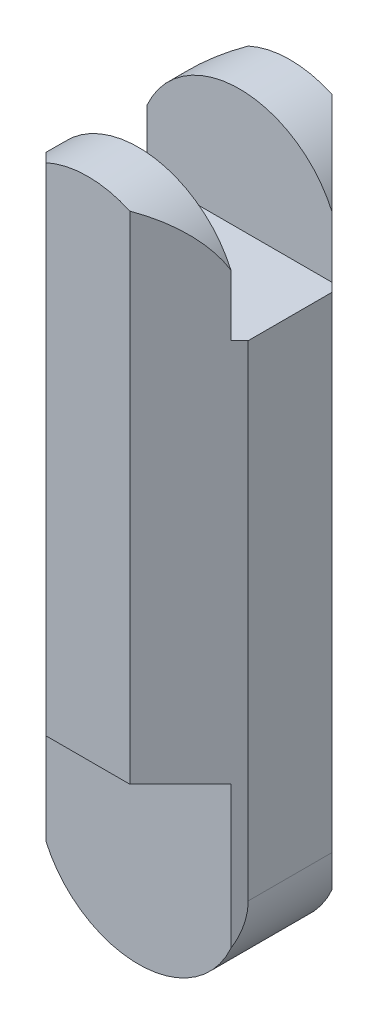
ISO-10303-21;
HEADER;
FILE_DESCRIPTION(('STEP AP214'),'2;1');
FILE_NAME('part.step','',(''),(''),'','','');
FILE_SCHEMA(('AUTOMOTIVE_DESIGN { 1 0 10303 214 1 1 1 1 }'));
ENDSEC;
DATA;
#1=APPLICATION_CONTEXT('core data for automotive mechanical design processes');
#2=APPLICATION_PROTOCOL_DEFINITION('international standard','automotive_design',2000,#1);
#3=PRODUCT_CONTEXT('',#1,'mechanical');
#4=PRODUCT('Part','Part','',(#3));
#5=PRODUCT_RELATED_PRODUCT_CATEGORY('part','',(#4));
#6=PRODUCT_DEFINITION_FORMATION('','',#4);
#7=PRODUCT_DEFINITION_CONTEXT('part definition',#1,'design');
#8=PRODUCT_DEFINITION('design','',#6,#7);
#9=PRODUCT_DEFINITION_SHAPE('','',#8);
#10=(LENGTH_UNIT() NAMED_UNIT(*) SI_UNIT(.MILLI.,.METRE.));
#11=(NAMED_UNIT(*) PLANE_ANGLE_UNIT() SI_UNIT($,.RADIAN.));
#12=(NAMED_UNIT(*) SI_UNIT($,.STERADIAN.) SOLID_ANGLE_UNIT());
#13=UNCERTAINTY_MEASURE_WITH_UNIT(LENGTH_MEASURE(1.E-05),#10,'distance_accuracy_value','');
#14=(GEOMETRIC_REPRESENTATION_CONTEXT(3) GLOBAL_UNCERTAINTY_ASSIGNED_CONTEXT((#13)) GLOBAL_UNIT_ASSIGNED_CONTEXT((#10,
#11,#12)) REPRESENTATION_CONTEXT('',''));
#15=CARTESIAN_POINT('',(0.,0.,0.));
#16=DIRECTION('',(0.,0.,1.));
#17=DIRECTION('',(1.,0.,0.));
#18=AXIS2_PLACEMENT_3D('',#15,#16,#17);
#19=CARTESIAN_POINT('',(4.14213562373094,78.,-10.));
#20=DIRECTION('',(0.,0.,1.));
#21=DIRECTION('',(1.,0.,0.));
#22=AXIS2_PLACEMENT_3D('',#19,#20,#21);
#23=PLANE('',#22);
#24=DIRECTION('',(0.,-1.,0.));
#25=VECTOR('',#24,1.);
#26=CARTESIAN_POINT('',(-4.14213562373096,78.,-10.));
#27=LINE('',#26,#25);
#28=CARTESIAN_POINT('',(-4.14213562373096,69.1017972112445,-10.));
#29=VERTEX_POINT('',#28);
#30=CARTESIAN_POINT('',(-4.14213562373096,20.,-10.));
#31=VERTEX_POINT('',#30);
#32=EDGE_CURVE('E174',#29,#31,#27,.T.);
#33=ORIENTED_EDGE('',*,*,#32,.F.);
#34=CARTESIAN_POINT('',(0.,60.,-10.));
#35=DIRECTION('',(0.,0.,1.));
#36=DIRECTION('',(1.,0.,0.));
#37=AXIS2_PLACEMENT_3D('',#34,#35,#36);
#38=CIRCLE('',#37,10.);
#39=CARTESIAN_POINT('',(4.14213562373094,69.1017972112445,-10.));
#40=VERTEX_POINT('',#39);
#41=EDGE_CURVE('E297',#29,#40,#38,.F.);
#42=ORIENTED_EDGE('',*,*,#41,.T.);
#43=DIRECTION('',(0.,-1.,0.));
#44=VECTOR('',#43,1.);
#45=CARTESIAN_POINT('',(4.14213562373094,78.,-10.));
#46=LINE('',#45,#44);
#47=CARTESIAN_POINT('',(4.14213562373094,20.,-10.));
#48=VERTEX_POINT('',#47);
#49=EDGE_CURVE('E176',#40,#48,#46,.T.);
#50=ORIENTED_EDGE('',*,*,#49,.T.);
#51=DIRECTION('',(1.,0.,0.));
#52=VECTOR('',#51,1.);
#53=CARTESIAN_POINT('',(10.,20.,-10.));
#54=LINE('',#53,#52);
#55=EDGE_CURVE('E232',#31,#48,#54,.T.);
#56=ORIENTED_EDGE('',*,*,#55,.F.);
#57=EDGE_LOOP('',(#33,#42,#50,#56));
#58=FACE_BOUND('',#57,.T.);
#59=ADVANCED_FACE('F34',(#58),#23,.F.);
#60=CARTESIAN_POINT('',(-4.14213562373096,78.,10.));
#61=DIRECTION('',(0.,0.,-1.));
#62=DIRECTION('',(-1.,0.,0.));
#63=AXIS2_PLACEMENT_3D('',#60,#61,#62);
#64=PLANE('',#63);
#65=DIRECTION('',(0.,-1.,0.));
#66=VECTOR('',#65,1.);
#67=CARTESIAN_POINT('',(4.14213562373096,78.,10.));
#68=LINE('',#67,#66);
#69=CARTESIAN_POINT('',(4.14213562373096,69.1017972112445,10.));
#70=VERTEX_POINT('',#69);
#71=CARTESIAN_POINT('',(4.14213562373096,20.,10.));
#72=VERTEX_POINT('',#71);
#73=EDGE_CURVE('E159',#70,#72,#68,.T.);
#74=ORIENTED_EDGE('',*,*,#73,.F.);
#75=CARTESIAN_POINT('',(0.,60.,10.));
#76=DIRECTION('',(0.,0.,-1.));
#77=DIRECTION('',(1.,0.,0.));
#78=AXIS2_PLACEMENT_3D('',#75,#76,#77);
#79=CIRCLE('',#78,10.);
#80=CARTESIAN_POINT('',(-4.14213562373096,69.1017972112445,10.));
#81=VERTEX_POINT('',#80);
#82=EDGE_CURVE('E147',#81,#70,#79,.T.);
#83=ORIENTED_EDGE('',*,*,#82,.F.);
#84=DIRECTION('',(0.,-1.,0.));
#85=VECTOR('',#84,1.);
#86=CARTESIAN_POINT('',(-4.14213562373096,78.,10.));
#87=LINE('',#86,#85);
#88=CARTESIAN_POINT('',(-4.14213562373096,20.,10.));
#89=VERTEX_POINT('',#88);
#90=EDGE_CURVE('E157',#81,#89,#87,.T.);
#91=ORIENTED_EDGE('',*,*,#90,.T.);
#92=DIRECTION('',(-1.,0.,0.));
#93=VECTOR('',#92,1.);
#94=CARTESIAN_POINT('',(-10.,20.,10.));
#95=LINE('',#94,#93);
#96=EDGE_CURVE('E245',#72,#89,#95,.T.);
#97=ORIENTED_EDGE('',*,*,#96,.F.);
#98=EDGE_LOOP('',(#74,#83,#91,#97));
#99=FACE_BOUND('',#98,.T.);
#100=ADVANCED_FACE('F155',(#99),#64,.F.);
#101=CARTESIAN_POINT('',(10.,78.,-4.14213562373095));
#102=DIRECTION('',(-0.707106781186547,0.,0.707106781186548));
#103=DIRECTION('',(0.707106781186548,0.,0.707106781186547));
#104=AXIS2_PLACEMENT_3D('',#101,#102,#103);
#105=PLANE('',#104);
#106=ORIENTED_EDGE('',*,*,#49,.F.);
#107=CARTESIAN_POINT('',(0.,60.,-14.1421356237309));
#108=DIRECTION('',(-0.707106781186547,0.,0.707106781186548));
#109=DIRECTION('',(0.707106781186548,0.,0.707106781186547));
#110=AXIS2_PLACEMENT_3D('',#107,#108,#109);
#111=ELLIPSE('',#110,14.1421356237309,10.);
#112=CARTESIAN_POINT('',(9.14213562373095,64.0523272618718,-5.));
#113=VERTEX_POINT('',#112);
#114=EDGE_CURVE('E300',#40,#113,#111,.F.);
#115=ORIENTED_EDGE('',*,*,#114,.T.);
#116=DIRECTION('',(0.,1.,0.));
#117=VECTOR('',#116,1.);
#118=CARTESIAN_POINT('',(9.14213562373095,78.,-5.));
#119=LINE('',#118,#117);
#120=CARTESIAN_POINT('',(9.14213562373095,58.,-5.));
#121=VERTEX_POINT('',#120);
#122=EDGE_CURVE('E221',#121,#113,#119,.T.);
#123=ORIENTED_EDGE('',*,*,#122,.F.);
#124=DIRECTION('',(0.707106781186548,0.,0.707106781186547));
#125=VECTOR('',#124,1.);
#126=CARTESIAN_POINT('',(10.,58.,-4.14213562373095));
#127=LINE('',#126,#125);
#128=CARTESIAN_POINT('',(10.,58.,-4.14213562373095));
#129=VERTEX_POINT('',#128);
#130=EDGE_CURVE('E230',#121,#129,#127,.T.);
#131=ORIENTED_EDGE('',*,*,#130,.T.);
#132=DIRECTION('',(0.,-1.,0.));
#133=VECTOR('',#132,1.);
#134=CARTESIAN_POINT('',(10.,78.,-4.14213562373095));
#135=LINE('',#134,#133);
#136=CARTESIAN_POINT('',(10.,10.,-4.14213562373095));
#137=VERTEX_POINT('',#136);
#138=EDGE_CURVE('E178',#129,#137,#135,.T.);
#139=ORIENTED_EDGE('',*,*,#138,.T.);
#140=CARTESIAN_POINT('',(0.,10.,-14.1421356237309));
#141=DIRECTION('',(-0.707106781186547,0.,0.707106781186548));
#142=DIRECTION('',(0.707106781186548,0.,0.707106781186547));
#143=AXIS2_PLACEMENT_3D('',#140,#141,#142);
#144=ELLIPSE('',#143,14.1421356237309,10.);
#145=CARTESIAN_POINT('',(9.14213562373095,5.94767273812816,-5.00000000000001));
#146=VERTEX_POINT('',#145);
#147=EDGE_CURVE('E269',#137,#146,#144,.F.);
#148=ORIENTED_EDGE('',*,*,#147,.T.);
#149=DIRECTION('',(0.,-1.,0.));
#150=VECTOR('',#149,1.);
#151=CARTESIAN_POINT('',(9.14213562373095,78.,-5.00000000000001));
#152=LINE('',#151,#150);
#153=CARTESIAN_POINT('',(9.14213562373095,20.,-5.00000000000001));
#154=VERTEX_POINT('',#153);
#155=EDGE_CURVE('E238',#154,#146,#152,.T.);
#156=ORIENTED_EDGE('',*,*,#155,.F.);
#157=DIRECTION('',(-0.707106781186548,0.,-0.707106781186547));
#158=VECTOR('',#157,1.);
#159=CARTESIAN_POINT('',(10.,20.,-4.14213562373095));
#160=LINE('',#159,#158);
#161=EDGE_CURVE('E242',#154,#48,#160,.T.);
#162=ORIENTED_EDGE('',*,*,#161,.T.);
#163=EDGE_LOOP('',(#106,#115,#123,#131,#139,#148,#156,#162));
#164=FACE_BOUND('',#163,.T.);
#165=ADVANCED_FACE('F275',(#164),#105,.F.);
#166=CARTESIAN_POINT('',(-4.14213562373096,78.,-10.));
#167=DIRECTION('',(0.707106781186548,0.,0.707106781186547));
#168=DIRECTION('',(0.707106781186547,0.,-0.707106781186548));
#169=AXIS2_PLACEMENT_3D('',#166,#167,#168);
#170=PLANE('',#169);
#171=DIRECTION('',(0.,-1.,0.));
#172=VECTOR('',#171,1.);
#173=CARTESIAN_POINT('',(-9.14213562373095,78.,-5.));
#174=LINE('',#173,#172);
#175=CARTESIAN_POINT('',(-9.14213562373095,64.0523272618718,-5.));
#176=VERTEX_POINT('',#175);
#177=CARTESIAN_POINT('',(-9.14213562373095,58.,-5.));
#178=VERTEX_POINT('',#177);
#179=EDGE_CURVE('E219',#176,#178,#174,.T.);
#180=ORIENTED_EDGE('',*,*,#179,.F.);
#181=CARTESIAN_POINT('',(0.,60.,-14.142135623731));
#182=DIRECTION('',(0.707106781186548,0.,0.707106781186547));
#183=DIRECTION('',(-0.707106781186547,0.,0.707106781186548));
#184=AXIS2_PLACEMENT_3D('',#181,#182,#183);
#185=ELLIPSE('',#184,14.142135623731,10.);
#186=EDGE_CURVE('E49',#176,#29,#185,.F.);
#187=ORIENTED_EDGE('',*,*,#186,.T.);
#188=ORIENTED_EDGE('',*,*,#32,.T.);
#189=DIRECTION('',(-0.707106781186547,0.,0.707106781186548));
#190=VECTOR('',#189,1.);
#191=CARTESIAN_POINT('',(-4.14213562373096,20.,-10.));
#192=LINE('',#191,#190);
#193=CARTESIAN_POINT('',(-9.14213562373096,20.,-5.));
#194=VERTEX_POINT('',#193);
#195=EDGE_CURVE('E187',#31,#194,#192,.T.);
#196=ORIENTED_EDGE('',*,*,#195,.T.);
#197=DIRECTION('',(0.,1.,0.));
#198=VECTOR('',#197,1.);
#199=CARTESIAN_POINT('',(-9.14213562373095,78.,-5.));
#200=LINE('',#199,#198);
#201=CARTESIAN_POINT('',(-9.14213562373095,5.9476727381282,-5.));
#202=VERTEX_POINT('',#201);
#203=EDGE_CURVE('E185',#202,#194,#200,.T.);
#204=ORIENTED_EDGE('',*,*,#203,.F.);
#205=CARTESIAN_POINT('',(0.,10.,-14.142135623731));
#206=DIRECTION('',(0.707106781186548,0.,0.707106781186547));
#207=DIRECTION('',(-0.707106781186547,0.,0.707106781186548));
#208=AXIS2_PLACEMENT_3D('',#205,#206,#207);
#209=ELLIPSE('',#208,14.142135623731,10.);
#210=CARTESIAN_POINT('',(-10.,10.,-4.14213562373095));
#211=VERTEX_POINT('',#210);
#212=EDGE_CURVE('E259',#202,#211,#209,.F.);
#213=ORIENTED_EDGE('',*,*,#212,.T.);
#214=DIRECTION('',(0.,-1.,0.));
#215=VECTOR('',#214,1.);
#216=CARTESIAN_POINT('',(-10.,78.,-4.14213562373095));
#217=LINE('',#216,#215);
#218=CARTESIAN_POINT('',(-10.,58.,-4.14213562373096));
#219=VERTEX_POINT('',#218);
#220=EDGE_CURVE('E167',#219,#211,#217,.T.);
#221=ORIENTED_EDGE('',*,*,#220,.F.);
#222=DIRECTION('',(0.707106781186547,0.,-0.707106781186548));
#223=VECTOR('',#222,1.);
#224=CARTESIAN_POINT('',(-4.14213562373096,58.,-10.));
#225=LINE('',#224,#223);
#226=EDGE_CURVE('E227',#219,#178,#225,.T.);
#227=ORIENTED_EDGE('',*,*,#226,.T.);
#228=EDGE_LOOP('',(#180,#187,#188,#196,#204,#213,#221,#227));
#229=FACE_BOUND('',#228,.T.);
#230=ADVANCED_FACE('F288',(#229),#170,.F.);
#231=CARTESIAN_POINT('',(0.,0.,-5.));
#232=DIRECTION('',(0.,0.,1.));
#233=DIRECTION('',(1.,0.,0.));
#234=AXIS2_PLACEMENT_3D('',#231,#232,#233);
#235=PLANE('',#234);
#236=CARTESIAN_POINT('',(0.,60.,-5.));
#237=DIRECTION('',(0.,0.,1.));
#238=DIRECTION('',(1.,0.,0.));
#239=AXIS2_PLACEMENT_3D('',#236,#237,#238);
#240=CIRCLE('',#239,10.);
#241=EDGE_CURVE('E151',#176,#113,#240,.F.);
#242=ORIENTED_EDGE('',*,*,#241,.F.);
#243=ORIENTED_EDGE('',*,*,#179,.T.);
#244=DIRECTION('',(1.,0.,0.));
#245=VECTOR('',#244,1.);
#246=CARTESIAN_POINT('',(-10.,58.,-5.));
#247=LINE('',#246,#245);
#248=EDGE_CURVE('E213',#178,#121,#247,.T.);
#249=ORIENTED_EDGE('',*,*,#248,.T.);
#250=ORIENTED_EDGE('',*,*,#122,.T.);
#251=EDGE_LOOP('',(#242,#243,#249,#250));
#252=FACE_BOUND('',#251,.T.);
#253=ADVANCED_FACE('F304',(#252),#235,.T.);
#254=CARTESIAN_POINT('',(0.,0.,5.));
#255=DIRECTION('',(0.,0.,1.));
#256=DIRECTION('',(1.,0.,0.));
#257=AXIS2_PLACEMENT_3D('',#254,#255,#256);
#258=PLANE('',#257);
#259=DIRECTION('',(0.,-1.,0.));
#260=VECTOR('',#259,1.);
#261=CARTESIAN_POINT('',(-9.14213562373096,78.,5.));
#262=LINE('',#261,#260);
#263=CARTESIAN_POINT('',(-9.14213562373096,64.0523272618718,5.));
#264=VERTEX_POINT('',#263);
#265=CARTESIAN_POINT('',(-9.14213562373096,58.,5.));
#266=VERTEX_POINT('',#265);
#267=EDGE_CURVE('E211',#264,#266,#262,.T.);
#268=ORIENTED_EDGE('',*,*,#267,.F.);
#269=CARTESIAN_POINT('',(0.,60.,5.));
#270=DIRECTION('',(0.,0.,1.));
#271=DIRECTION('',(1.,0.,0.));
#272=AXIS2_PLACEMENT_3D('',#269,#270,#271);
#273=CIRCLE('',#272,10.);
#274=CARTESIAN_POINT('',(9.14213562373096,64.0523272618718,5.));
#275=VERTEX_POINT('',#274);
#276=EDGE_CURVE('E11',#264,#275,#273,.F.);
#277=ORIENTED_EDGE('',*,*,#276,.T.);
#278=DIRECTION('',(0.,1.,0.));
#279=VECTOR('',#278,1.);
#280=CARTESIAN_POINT('',(9.14213562373096,78.,5.));
#281=LINE('',#280,#279);
#282=CARTESIAN_POINT('',(9.14213562373096,58.,5.));
#283=VERTEX_POINT('',#282);
#284=EDGE_CURVE('E194',#283,#275,#281,.T.);
#285=ORIENTED_EDGE('',*,*,#284,.F.);
#286=DIRECTION('',(1.,0.,0.));
#287=VECTOR('',#286,1.);
#288=CARTESIAN_POINT('',(-10.,58.,5.));
#289=LINE('',#288,#287);
#290=EDGE_CURVE('E205',#266,#283,#289,.T.);
#291=ORIENTED_EDGE('',*,*,#290,.F.);
#292=EDGE_LOOP('',(#268,#277,#285,#291));
#293=FACE_BOUND('',#292,.T.);
#294=ADVANCED_FACE('F323',(#293),#258,.F.);
#295=CARTESIAN_POINT('',(0.,10.,-56.));
#296=DIRECTION('',(0.,0.,1.));
#297=DIRECTION('',(1.,0.,0.));
#298=AXIS2_PLACEMENT_3D('',#295,#296,#297);
#299=CYLINDRICAL_SURFACE('',#298,10.);
#300=CARTESIAN_POINT('',(0.,10.,-5.));
#301=DIRECTION('',(0.,0.,-1.));
#302=DIRECTION('',(-1.,0.,0.));
#303=AXIS2_PLACEMENT_3D('',#300,#301,#302);
#304=CIRCLE('',#303,10.);
#305=EDGE_CURVE('E233',#146,#202,#304,.T.);
#306=ORIENTED_EDGE('',*,*,#305,.F.);
#307=ORIENTED_EDGE('',*,*,#147,.F.);
#308=DIRECTION('',(0.,0.,1.));
#309=VECTOR('',#308,1.);
#310=CARTESIAN_POINT('',(10.,10.,-56.));
#311=LINE('',#310,#309);
#312=CARTESIAN_POINT('',(10.,9.99999999999999,4.14213562373095));
#313=VERTEX_POINT('',#312);
#314=EDGE_CURVE('E256',#137,#313,#311,.T.);
#315=ORIENTED_EDGE('',*,*,#314,.T.);
#316=CARTESIAN_POINT('',(0.,10.,14.1421356237309));
#317=DIRECTION('',(-0.707106781186547,0.,-0.707106781186548));
#318=DIRECTION('',(-0.707106781186548,0.,0.707106781186547));
#319=AXIS2_PLACEMENT_3D('',#316,#317,#318);
#320=ELLIPSE('',#319,14.1421356237309,10.);
#321=CARTESIAN_POINT('',(9.14213562373095,5.94767273812818,5.));
#322=VERTEX_POINT('',#321);
#323=EDGE_CURVE('E264',#322,#313,#320,.F.);
#324=ORIENTED_EDGE('',*,*,#323,.F.);
#325=CARTESIAN_POINT('',(0.,10.,5.));
#326=DIRECTION('',(0.,0.,1.));
#327=DIRECTION('',(1.,0.,0.));
#328=AXIS2_PLACEMENT_3D('',#325,#326,#327);
#329=CIRCLE('',#328,10.);
#330=CARTESIAN_POINT('',(-9.14213562373095,5.94767273812819,5.00000000000001));
#331=VERTEX_POINT('',#330);
#332=EDGE_CURVE('E180',#331,#322,#329,.T.);
#333=ORIENTED_EDGE('',*,*,#332,.F.);
#334=CARTESIAN_POINT('',(0.,10.,14.142135623731));
#335=DIRECTION('',(0.707106781186548,0.,-0.707106781186547));
#336=DIRECTION('',(0.707106781186547,0.,0.707106781186548));
#337=AXIS2_PLACEMENT_3D('',#334,#335,#336);
#338=ELLIPSE('',#337,14.142135623731,10.);
#339=CARTESIAN_POINT('',(-10.,10.,4.14213562373096));
#340=VERTEX_POINT('',#339);
#341=EDGE_CURVE('E266',#340,#331,#338,.F.);
#342=ORIENTED_EDGE('',*,*,#341,.F.);
#343=DIRECTION('',(0.,0.,1.));
#344=VECTOR('',#343,1.);
#345=CARTESIAN_POINT('',(-10.,10.,-56.));
#346=LINE('',#345,#344);
#347=EDGE_CURVE('E255',#211,#340,#346,.T.);
#348=ORIENTED_EDGE('',*,*,#347,.F.);
#349=ORIENTED_EDGE('',*,*,#212,.F.);
#350=EDGE_LOOP('',(#306,#307,#315,#324,#333,#342,#348,#349));
#351=FACE_BOUND('',#350,.T.);
#352=ADVANCED_FACE('F278',(#351),#299,.T.);
#353=CARTESIAN_POINT('',(-10.,78.,-4.14213562373095));
#354=DIRECTION('',(1.,0.,0.));
#355=DIRECTION('',(0.,0.,-1.));
#356=AXIS2_PLACEMENT_3D('',#353,#354,#355);
#357=PLANE('',#356);
#358=DIRECTION('',(0.,-1.,0.));
#359=VECTOR('',#358,1.);
#360=CARTESIAN_POINT('',(-10.,78.,4.14213562373096));
#361=LINE('',#360,#359);
#362=CARTESIAN_POINT('',(-10.,58.,4.14213562373096));
#363=VERTEX_POINT('',#362);
#364=EDGE_CURVE('E165',#363,#340,#361,.T.);
#365=ORIENTED_EDGE('',*,*,#364,.F.);
#366=DIRECTION('',(0.,0.,1.));
#367=VECTOR('',#366,1.);
#368=CARTESIAN_POINT('',(-10.,58.,-5.));
#369=LINE('',#368,#367);
#370=EDGE_CURVE('E209',#219,#363,#369,.T.);
#371=ORIENTED_EDGE('',*,*,#370,.F.);
#372=ORIENTED_EDGE('',*,*,#220,.T.);
#373=ORIENTED_EDGE('',*,*,#347,.T.);
#374=EDGE_LOOP('',(#365,#371,#372,#373));
#375=FACE_BOUND('',#374,.T.);
#376=ADVANCED_FACE('F320',(#375),#357,.F.);
#377=CARTESIAN_POINT('',(10.,78.,4.14213562373095));
#378=DIRECTION('',(-1.,0.,0.));
#379=DIRECTION('',(0.,0.,1.));
#380=AXIS2_PLACEMENT_3D('',#377,#378,#379);
#381=PLANE('',#380);
#382=ORIENTED_EDGE('',*,*,#138,.F.);
#383=DIRECTION('',(0.,0.,1.));
#384=VECTOR('',#383,1.);
#385=CARTESIAN_POINT('',(10.,58.,-5.));
#386=LINE('',#385,#384);
#387=CARTESIAN_POINT('',(10.,58.,4.14213562373096));
#388=VERTEX_POINT('',#387);
#389=EDGE_CURVE('E201',#129,#388,#386,.T.);
#390=ORIENTED_EDGE('',*,*,#389,.T.);
#391=DIRECTION('',(0.,-1.,0.));
#392=VECTOR('',#391,1.);
#393=CARTESIAN_POINT('',(10.,78.,4.14213562373095));
#394=LINE('',#393,#392);
#395=EDGE_CURVE('E169',#388,#313,#394,.T.);
#396=ORIENTED_EDGE('',*,*,#395,.T.);
#397=ORIENTED_EDGE('',*,*,#314,.F.);
#398=EDGE_LOOP('',(#382,#390,#396,#397));
#399=FACE_BOUND('',#398,.T.);
#400=ADVANCED_FACE('F36',(#399),#381,.F.);
#401=CARTESIAN_POINT('',(-10.,78.,4.14213562373096));
#402=DIRECTION('',(0.707106781186548,0.,-0.707106781186547));
#403=DIRECTION('',(-0.707106781186547,0.,-0.707106781186548));
#404=AXIS2_PLACEMENT_3D('',#401,#402,#403);
#405=PLANE('',#404);
#406=ORIENTED_EDGE('',*,*,#90,.F.);
#407=CARTESIAN_POINT('',(0.,60.,14.142135623731));
#408=DIRECTION('',(0.707106781186548,0.,-0.707106781186547));
#409=DIRECTION('',(0.707106781186547,0.,0.707106781186548));
#410=AXIS2_PLACEMENT_3D('',#407,#408,#409);
#411=ELLIPSE('',#410,14.142135623731,10.);
#412=EDGE_CURVE('E144',#81,#264,#411,.F.);
#413=ORIENTED_EDGE('',*,*,#412,.T.);
#414=ORIENTED_EDGE('',*,*,#267,.T.);
#415=DIRECTION('',(-0.707106781186547,0.,-0.707106781186548));
#416=VECTOR('',#415,1.);
#417=CARTESIAN_POINT('',(-10.,58.,4.14213562373096));
#418=LINE('',#417,#416);
#419=EDGE_CURVE('E224',#266,#363,#418,.T.);
#420=ORIENTED_EDGE('',*,*,#419,.T.);
#421=ORIENTED_EDGE('',*,*,#364,.T.);
#422=ORIENTED_EDGE('',*,*,#341,.T.);
#423=DIRECTION('',(0.,-1.,0.));
#424=VECTOR('',#423,1.);
#425=CARTESIAN_POINT('',(-9.14213562373095,78.,5.));
#426=LINE('',#425,#424);
#427=CARTESIAN_POINT('',(-9.14213562373095,20.,5.));
#428=VERTEX_POINT('',#427);
#429=EDGE_CURVE('E252',#428,#331,#426,.T.);
#430=ORIENTED_EDGE('',*,*,#429,.F.);
#431=DIRECTION('',(0.707106781186547,0.,0.707106781186548));
#432=VECTOR('',#431,1.);
#433=CARTESIAN_POINT('',(-10.,20.,4.14213562373096));
#434=LINE('',#433,#432);
#435=EDGE_CURVE('E164',#428,#89,#434,.T.);
#436=ORIENTED_EDGE('',*,*,#435,.T.);
#437=EDGE_LOOP('',(#406,#413,#414,#420,#421,#422,#430,#436));
#438=FACE_BOUND('',#437,.T.);
#439=ADVANCED_FACE('F162',(#438),#405,.F.);
#440=CARTESIAN_POINT('',(4.14213562373096,78.,10.));
#441=DIRECTION('',(-0.707106781186547,0.,-0.707106781186548));
#442=DIRECTION('',(-0.707106781186548,0.,0.707106781186547));
#443=AXIS2_PLACEMENT_3D('',#440,#441,#442);
#444=PLANE('',#443);
#445=ORIENTED_EDGE('',*,*,#284,.T.);
#446=CARTESIAN_POINT('',(0.,60.,14.142135623731));
#447=DIRECTION('',(-0.707106781186547,0.,-0.707106781186548));
#448=DIRECTION('',(-0.707106781186548,0.,0.707106781186547));
#449=AXIS2_PLACEMENT_3D('',#446,#447,#448);
#450=ELLIPSE('',#449,14.1421356237309,10.);
#451=EDGE_CURVE('E57',#275,#70,#450,.F.);
#452=ORIENTED_EDGE('',*,*,#451,.T.);
#453=ORIENTED_EDGE('',*,*,#73,.T.);
#454=DIRECTION('',(0.707106781186548,0.,-0.707106781186547));
#455=VECTOR('',#454,1.);
#456=CARTESIAN_POINT('',(4.14213562373096,20.,10.));
#457=LINE('',#456,#455);
#458=CARTESIAN_POINT('',(9.14213562373096,20.,5.));
#459=VERTEX_POINT('',#458);
#460=EDGE_CURVE('E182',#72,#459,#457,.T.);
#461=ORIENTED_EDGE('',*,*,#460,.T.);
#462=DIRECTION('',(0.,1.,0.));
#463=VECTOR('',#462,1.);
#464=CARTESIAN_POINT('',(9.14213562373095,78.,5.));
#465=LINE('',#464,#463);
#466=EDGE_CURVE('E249',#322,#459,#465,.T.);
#467=ORIENTED_EDGE('',*,*,#466,.F.);
#468=ORIENTED_EDGE('',*,*,#323,.T.);
#469=ORIENTED_EDGE('',*,*,#395,.F.);
#470=DIRECTION('',(-0.707106781186548,0.,0.707106781186547));
#471=VECTOR('',#470,1.);
#472=CARTESIAN_POINT('',(4.14213562373096,58.,10.));
#473=LINE('',#472,#471);
#474=EDGE_CURVE('E42',#388,#283,#473,.T.);
#475=ORIENTED_EDGE('',*,*,#474,.T.);
#476=EDGE_LOOP('',(#445,#452,#453,#461,#467,#468,#469,#475));
#477=FACE_BOUND('',#476,.T.);
#478=ADVANCED_FACE('F193',(#477),#444,.F.);
#479=CARTESIAN_POINT('',(-10.,20.,5.));
#480=DIRECTION('',(0.,1.,0.));
#481=DIRECTION('',(0.,0.,1.));
#482=AXIS2_PLACEMENT_3D('',#479,#480,#481);
#483=PLANE('',#482);
#484=DIRECTION('',(-1.,0.,0.));
#485=VECTOR('',#484,1.);
#486=CARTESIAN_POINT('',(-10.,20.,5.));
#487=LINE('',#486,#485);
#488=EDGE_CURVE('E246',#459,#428,#487,.T.);
#489=ORIENTED_EDGE('',*,*,#488,.F.);
#490=ORIENTED_EDGE('',*,*,#460,.F.);
#491=ORIENTED_EDGE('',*,*,#96,.T.);
#492=ORIENTED_EDGE('',*,*,#435,.F.);
#493=EDGE_LOOP('',(#489,#490,#491,#492));
#494=FACE_BOUND('',#493,.T.);
#495=ADVANCED_FACE('F313',(#494),#483,.F.);
#496=CARTESIAN_POINT('',(0.,10.,5.));
#497=DIRECTION('',(0.,0.,1.));
#498=DIRECTION('',(1.,0.,0.));
#499=AXIS2_PLACEMENT_3D('',#496,#497,#498);
#500=PLANE('',#499);
#501=ORIENTED_EDGE('',*,*,#429,.T.);
#502=ORIENTED_EDGE('',*,*,#332,.T.);
#503=ORIENTED_EDGE('',*,*,#466,.T.);
#504=ORIENTED_EDGE('',*,*,#488,.T.);
#505=EDGE_LOOP('',(#501,#502,#503,#504));
#506=FACE_BOUND('',#505,.T.);
#507=ADVANCED_FACE('F315',(#506),#500,.T.);
#508=CARTESIAN_POINT('',(10.,20.,-5.00000000000001));
#509=DIRECTION('',(0.,1.,0.));
#510=DIRECTION('',(0.,0.,1.));
#511=AXIS2_PLACEMENT_3D('',#508,#509,#510);
#512=PLANE('',#511);
#513=DIRECTION('',(1.,0.,0.));
#514=VECTOR('',#513,1.);
#515=CARTESIAN_POINT('',(10.,20.,-5.00000000000001));
#516=LINE('',#515,#514);
#517=EDGE_CURVE('E235',#194,#154,#516,.T.);
#518=ORIENTED_EDGE('',*,*,#517,.F.);
#519=ORIENTED_EDGE('',*,*,#195,.F.);
#520=ORIENTED_EDGE('',*,*,#55,.T.);
#521=ORIENTED_EDGE('',*,*,#161,.F.);
#522=EDGE_LOOP('',(#518,#519,#520,#521));
#523=FACE_BOUND('',#522,.T.);
#524=ADVANCED_FACE('F294',(#523),#512,.F.);
#525=CARTESIAN_POINT('',(0.,10.,-5.));
#526=DIRECTION('',(0.,0.,-1.));
#527=DIRECTION('',(-1.,0.,0.));
#528=AXIS2_PLACEMENT_3D('',#525,#526,#527);
#529=PLANE('',#528);
#530=ORIENTED_EDGE('',*,*,#155,.T.);
#531=ORIENTED_EDGE('',*,*,#305,.T.);
#532=ORIENTED_EDGE('',*,*,#203,.T.);
#533=ORIENTED_EDGE('',*,*,#517,.T.);
#534=EDGE_LOOP('',(#530,#531,#532,#533));
#535=FACE_BOUND('',#534,.T.);
#536=ADVANCED_FACE('F284',(#535),#529,.T.);
#537=CARTESIAN_POINT('',(-10.,58.,-5.));
#538=DIRECTION('',(0.,-1.,0.));
#539=DIRECTION('',(0.,0.,-1.));
#540=AXIS2_PLACEMENT_3D('',#537,#538,#539);
#541=PLANE('',#540);
#542=ORIENTED_EDGE('',*,*,#248,.F.);
#543=ORIENTED_EDGE('',*,*,#226,.F.);
#544=ORIENTED_EDGE('',*,*,#370,.T.);
#545=ORIENTED_EDGE('',*,*,#419,.F.);
#546=ORIENTED_EDGE('',*,*,#290,.T.);
#547=ORIENTED_EDGE('',*,*,#474,.F.);
#548=ORIENTED_EDGE('',*,*,#389,.F.);
#549=ORIENTED_EDGE('',*,*,#130,.F.);
#550=EDGE_LOOP('',(#542,#543,#544,#545,#546,#547,#548,#549));
#551=FACE_BOUND('',#550,.T.);
#552=ADVANCED_FACE('F200',(#551),#541,.F.);
#553=CARTESIAN_POINT('',(0.,60.,-20.));
#554=DIRECTION('',(0.,0.,1.));
#555=DIRECTION('',(1.,0.,0.));
#556=AXIS2_PLACEMENT_3D('',#553,#554,#555);
#557=CYLINDRICAL_SURFACE('',#556,10.);
#558=ORIENTED_EDGE('',*,*,#82,.T.);
#559=ORIENTED_EDGE('',*,*,#451,.F.);
#560=ORIENTED_EDGE('',*,*,#276,.F.);
#561=ORIENTED_EDGE('',*,*,#412,.F.);
#562=EDGE_LOOP('',(#558,#559,#560,#561));
#563=FACE_BOUND('',#562,.T.);
#564=ADVANCED_FACE('F146',(#563),#557,.T.);
#565=ORIENTED_EDGE('',*,*,#186,.F.);
#566=ORIENTED_EDGE('',*,*,#241,.T.);
#567=ORIENTED_EDGE('',*,*,#114,.F.);
#568=ORIENTED_EDGE('',*,*,#41,.F.);
#569=EDGE_LOOP('',(#565,#566,#567,#568));
#570=FACE_BOUND('',#569,.T.);
#571=ADVANCED_FACE('F385',(#570),#557,.T.);
#572=CLOSED_SHELL('',(#59,#100,#165,#230,#253,#294,#352,#376,#400,#439,#478,#495,#507,#524,#536,
#552,#564,#571));
#573=MANIFOLD_SOLID_BREP('B2',#572);
#574=ADVANCED_BREP_SHAPE_REPRESENTATION('',(#18,#573),#14);
#575=SHAPE_DEFINITION_REPRESENTATION(#9,#574);
ENDSEC;
END-ISO-10303-21;
